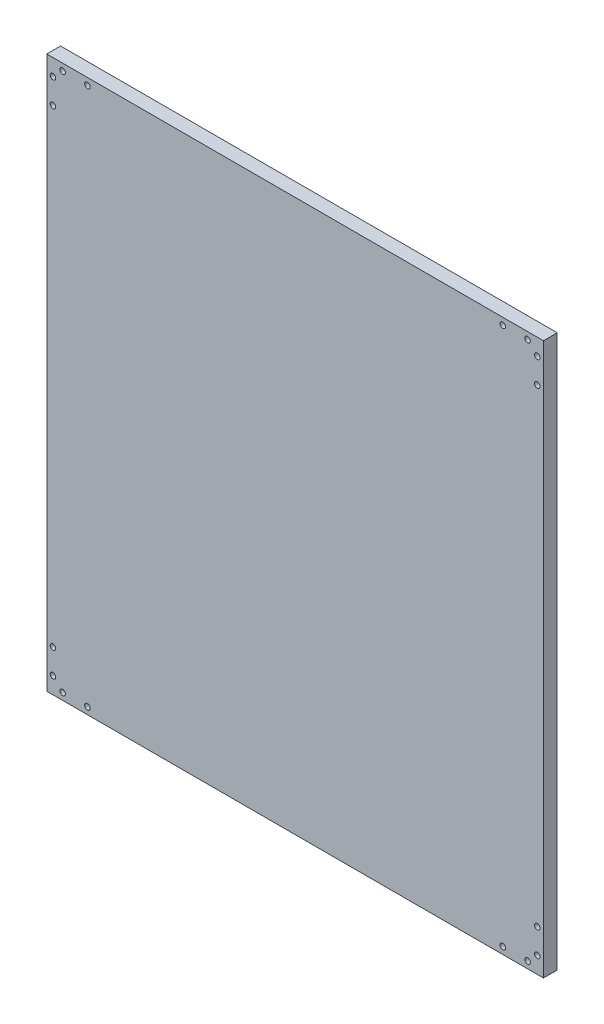
ISO-10303-21;
HEADER;
FILE_DESCRIPTION(('STEP AP214'),'2;1');
FILE_NAME('part.step','',(''),(''),'','','');
FILE_SCHEMA(('AUTOMOTIVE_DESIGN { 1 0 10303 214 1 1 1 1 }'));
ENDSEC;
DATA;
#1=APPLICATION_CONTEXT('core data for automotive mechanical design processes');
#2=APPLICATION_PROTOCOL_DEFINITION('international standard','automotive_design',2000,#1);
#3=PRODUCT_CONTEXT('',#1,'mechanical');
#4=PRODUCT('Part','Part','',(#3));
#5=PRODUCT_RELATED_PRODUCT_CATEGORY('part','',(#4));
#6=PRODUCT_DEFINITION_FORMATION('','',#4);
#7=PRODUCT_DEFINITION_CONTEXT('part definition',#1,'design');
#8=PRODUCT_DEFINITION('design','',#6,#7);
#9=PRODUCT_DEFINITION_SHAPE('','',#8);
#10=(LENGTH_UNIT() NAMED_UNIT(*) SI_UNIT(.MILLI.,.METRE.));
#11=(NAMED_UNIT(*) PLANE_ANGLE_UNIT() SI_UNIT($,.RADIAN.));
#12=(NAMED_UNIT(*) SI_UNIT($,.STERADIAN.) SOLID_ANGLE_UNIT());
#13=UNCERTAINTY_MEASURE_WITH_UNIT(LENGTH_MEASURE(1.E-05),#10,'distance_accuracy_value','');
#14=(GEOMETRIC_REPRESENTATION_CONTEXT(3) GLOBAL_UNCERTAINTY_ASSIGNED_CONTEXT((#13)) GLOBAL_UNIT_ASSIGNED_CONTEXT((#10,
#11,#12)) REPRESENTATION_CONTEXT('',''));
#15=CARTESIAN_POINT('',(0.,0.,0.));
#16=DIRECTION('',(0.,0.,1.));
#17=DIRECTION('',(1.,0.,0.));
#18=AXIS2_PLACEMENT_3D('',#15,#16,#17);
#19=CARTESIAN_POINT('',(0.,0.,10.));
#20=DIRECTION('',(0.,0.,-1.));
#21=DIRECTION('',(-1.,0.,0.));
#22=AXIS2_PLACEMENT_3D('',#19,#20,#21);
#23=PLANE('',#22);
#24=DIRECTION('',(0.,1.,0.));
#25=VECTOR('',#24,1.);
#26=CARTESIAN_POINT('',(180.,-200.,10.));
#27=LINE('',#26,#25);
#28=CARTESIAN_POINT('',(180.,-200.,10.));
#29=VERTEX_POINT('',#28);
#30=CARTESIAN_POINT('',(180.,200.,10.));
#31=VERTEX_POINT('',#30);
#32=EDGE_CURVE('E84',#29,#31,#27,.T.);
#33=ORIENTED_EDGE('',*,*,#32,.T.);
#34=DIRECTION('',(-1.,0.,0.));
#35=VECTOR('',#34,1.);
#36=CARTESIAN_POINT('',(-180.,200.,10.));
#37=LINE('',#36,#35);
#38=CARTESIAN_POINT('',(-180.,200.,10.));
#39=VERTEX_POINT('',#38);
#40=EDGE_CURVE('E79',#31,#39,#37,.T.);
#41=ORIENTED_EDGE('',*,*,#40,.T.);
#42=DIRECTION('',(0.,-1.,0.));
#43=VECTOR('',#42,1.);
#44=CARTESIAN_POINT('',(-180.,-200.,10.));
#45=LINE('',#44,#43);
#46=CARTESIAN_POINT('',(-180.,-200.,10.));
#47=VERTEX_POINT('',#46);
#48=EDGE_CURVE('E82',#39,#47,#45,.T.);
#49=ORIENTED_EDGE('',*,*,#48,.T.);
#50=DIRECTION('',(1.,0.,0.));
#51=VECTOR('',#50,1.);
#52=CARTESIAN_POINT('',(-180.,-200.,10.));
#53=LINE('',#52,#51);
#54=EDGE_CURVE('E49',#47,#29,#53,.T.);
#55=ORIENTED_EDGE('',*,*,#54,.T.);
#56=EDGE_LOOP('',(#33,#41,#49,#55));
#57=FACE_BOUND('',#56,.T.);
#58=CARTESIAN_POINT('',(150.5,195.,10.));
#59=DIRECTION('',(0.,0.,1.));
#60=DIRECTION('',(1.,0.,0.));
#61=AXIS2_PLACEMENT_3D('',#58,#59,#60);
#62=CIRCLE('',#61,2.);
#63=CARTESIAN_POINT('',(152.5,195.,10.));
#64=VERTEX_POINT('',#63);
#65=EDGE_CURVE('E99',#64,#64,#62,.T.);
#66=ORIENTED_EDGE('',*,*,#65,.F.);
#67=EDGE_LOOP('',(#66));
#68=FACE_BOUND('',#67,.T.);
#69=CARTESIAN_POINT('',(175.5,170.,10.));
#70=DIRECTION('',(0.,0.,1.));
#71=DIRECTION('',(1.,0.,0.));
#72=AXIS2_PLACEMENT_3D('',#69,#70,#71);
#73=CIRCLE('',#72,2.);
#74=CARTESIAN_POINT('',(177.5,170.,10.));
#75=VERTEX_POINT('',#74);
#76=EDGE_CURVE('E114',#75,#75,#73,.T.);
#77=ORIENTED_EDGE('',*,*,#76,.F.);
#78=EDGE_LOOP('',(#77));
#79=FACE_BOUND('',#78,.T.);
#80=CARTESIAN_POINT('',(168.5,195.,10.));
#81=DIRECTION('',(0.,0.,1.));
#82=DIRECTION('',(1.,0.,0.));
#83=AXIS2_PLACEMENT_3D('',#80,#81,#82);
#84=CIRCLE('',#83,2.);
#85=CARTESIAN_POINT('',(170.5,195.,10.));
#86=VERTEX_POINT('',#85);
#87=EDGE_CURVE('E120',#86,#86,#84,.T.);
#88=ORIENTED_EDGE('',*,*,#87,.F.);
#89=EDGE_LOOP('',(#88));
#90=FACE_BOUND('',#89,.T.);
#91=CARTESIAN_POINT('',(175.5,188.,10.));
#92=DIRECTION('',(0.,0.,1.));
#93=DIRECTION('',(1.,0.,0.));
#94=AXIS2_PLACEMENT_3D('',#91,#92,#93);
#95=CIRCLE('',#94,2.);
#96=CARTESIAN_POINT('',(177.5,188.,10.));
#97=VERTEX_POINT('',#96);
#98=EDGE_CURVE('E126',#97,#97,#95,.T.);
#99=ORIENTED_EDGE('',*,*,#98,.F.);
#100=EDGE_LOOP('',(#99));
#101=FACE_BOUND('',#100,.T.);
#102=CARTESIAN_POINT('',(-150.5,195.,9.99999999999881));
#103=DIRECTION('',(0.,0.,1.));
#104=DIRECTION('',(-1.,0.,0.));
#105=AXIS2_PLACEMENT_3D('',#102,#103,#104);
#106=CIRCLE('',#105,2.);
#107=CARTESIAN_POINT('',(-152.5,195.,9.9999999999988));
#108=VERTEX_POINT('',#107);
#109=EDGE_CURVE('E132',#108,#108,#106,.T.);
#110=ORIENTED_EDGE('',*,*,#109,.F.);
#111=EDGE_LOOP('',(#110));
#112=FACE_BOUND('',#111,.T.);
#113=CARTESIAN_POINT('',(-175.5,170.,9.99999999999864));
#114=DIRECTION('',(0.,0.,1.));
#115=DIRECTION('',(-1.,0.,0.));
#116=AXIS2_PLACEMENT_3D('',#113,#114,#115);
#117=CIRCLE('',#116,2.);
#118=CARTESIAN_POINT('',(-177.5,170.,9.99999999999863));
#119=VERTEX_POINT('',#118);
#120=EDGE_CURVE('E138',#119,#119,#117,.T.);
#121=ORIENTED_EDGE('',*,*,#120,.F.);
#122=EDGE_LOOP('',(#121));
#123=FACE_BOUND('',#122,.T.);
#124=CARTESIAN_POINT('',(-168.5,195.,9.99999999999869));
#125=DIRECTION('',(0.,0.,1.));
#126=DIRECTION('',(-1.,0.,0.));
#127=AXIS2_PLACEMENT_3D('',#124,#125,#126);
#128=CIRCLE('',#127,2.);
#129=CARTESIAN_POINT('',(-170.5,195.,9.99999999999867));
#130=VERTEX_POINT('',#129);
#131=EDGE_CURVE('E144',#130,#130,#128,.T.);
#132=ORIENTED_EDGE('',*,*,#131,.F.);
#133=EDGE_LOOP('',(#132));
#134=FACE_BOUND('',#133,.T.);
#135=CARTESIAN_POINT('',(-175.5,188.,9.99999999999864));
#136=DIRECTION('',(0.,0.,1.));
#137=DIRECTION('',(-1.,0.,0.));
#138=AXIS2_PLACEMENT_3D('',#135,#136,#137);
#139=CIRCLE('',#138,2.);
#140=CARTESIAN_POINT('',(-177.5,188.,9.99999999999863));
#141=VERTEX_POINT('',#140);
#142=EDGE_CURVE('E150',#141,#141,#139,.T.);
#143=ORIENTED_EDGE('',*,*,#142,.F.);
#144=EDGE_LOOP('',(#143));
#145=FACE_BOUND('',#144,.T.);
#146=CARTESIAN_POINT('',(-150.5,-195.,10.0000000000025));
#147=DIRECTION('',(0.,0.,1.));
#148=DIRECTION('',(0.,-1.,0.));
#149=AXIS2_PLACEMENT_3D('',#146,#147,#148);
#150=CIRCLE('',#149,2.);
#151=CARTESIAN_POINT('',(-150.5,-197.,10.0000000000026));
#152=VERTEX_POINT('',#151);
#153=EDGE_CURVE('E156',#152,#152,#150,.T.);
#154=ORIENTED_EDGE('',*,*,#153,.F.);
#155=EDGE_LOOP('',(#154));
#156=FACE_BOUND('',#155,.T.);
#157=CARTESIAN_POINT('',(-175.5,-170.,10.0000000000025));
#158=DIRECTION('',(0.,0.,1.));
#159=DIRECTION('',(0.,-1.,0.));
#160=AXIS2_PLACEMENT_3D('',#157,#158,#159);
#161=CIRCLE('',#160,2.);
#162=CARTESIAN_POINT('',(-175.5,-172.,10.0000000000026));
#163=VERTEX_POINT('',#162);
#164=EDGE_CURVE('E162',#163,#163,#161,.T.);
#165=ORIENTED_EDGE('',*,*,#164,.F.);
#166=EDGE_LOOP('',(#165));
#167=FACE_BOUND('',#166,.T.);
#168=CARTESIAN_POINT('',(-168.5,-195.,10.0000000000027));
#169=DIRECTION('',(0.,0.,1.));
#170=DIRECTION('',(0.,-1.,0.));
#171=AXIS2_PLACEMENT_3D('',#168,#169,#170);
#172=CIRCLE('',#171,2.);
#173=CARTESIAN_POINT('',(-168.5,-197.,10.0000000000027));
#174=VERTEX_POINT('',#173);
#175=EDGE_CURVE('E168',#174,#174,#172,.T.);
#176=ORIENTED_EDGE('',*,*,#175,.F.);
#177=EDGE_LOOP('',(#176));
#178=FACE_BOUND('',#177,.T.);
#179=CARTESIAN_POINT('',(-175.5,-188.,10.0000000000027));
#180=DIRECTION('',(0.,0.,1.));
#181=DIRECTION('',(0.,-1.,0.));
#182=AXIS2_PLACEMENT_3D('',#179,#180,#181);
#183=CIRCLE('',#182,2.);
#184=CARTESIAN_POINT('',(-175.5,-190.,10.0000000000027));
#185=VERTEX_POINT('',#184);
#186=EDGE_CURVE('E174',#185,#185,#183,.T.);
#187=ORIENTED_EDGE('',*,*,#186,.F.);
#188=EDGE_LOOP('',(#187));
#189=FACE_BOUND('',#188,.T.);
#190=CARTESIAN_POINT('',(150.5,-195.,10.0000000000014));
#191=DIRECTION('',(0.,0.,1.));
#192=DIRECTION('',(0.,1.,0.));
#193=AXIS2_PLACEMENT_3D('',#190,#191,#192);
#194=CIRCLE('',#193,2.);
#195=CARTESIAN_POINT('',(150.5,-193.,10.0000000000013));
#196=VERTEX_POINT('',#195);
#197=EDGE_CURVE('E180',#196,#196,#194,.T.);
#198=ORIENTED_EDGE('',*,*,#197,.F.);
#199=EDGE_LOOP('',(#198));
#200=FACE_BOUND('',#199,.T.);
#201=CARTESIAN_POINT('',(175.5,-170.,10.0000000000012));
#202=DIRECTION('',(0.,0.,1.));
#203=DIRECTION('',(0.,1.,0.));
#204=AXIS2_PLACEMENT_3D('',#201,#202,#203);
#205=CIRCLE('',#204,2.);
#206=CARTESIAN_POINT('',(175.5,-168.,10.0000000000012));
#207=VERTEX_POINT('',#206);
#208=EDGE_CURVE('E186',#207,#207,#205,.T.);
#209=ORIENTED_EDGE('',*,*,#208,.F.);
#210=EDGE_LOOP('',(#209));
#211=FACE_BOUND('',#210,.T.);
#212=CARTESIAN_POINT('',(168.5,-195.,10.0000000000014));
#213=DIRECTION('',(0.,0.,1.));
#214=DIRECTION('',(0.,1.,0.));
#215=AXIS2_PLACEMENT_3D('',#212,#213,#214);
#216=CIRCLE('',#215,2.);
#217=CARTESIAN_POINT('',(168.5,-193.,10.0000000000013));
#218=VERTEX_POINT('',#217);
#219=EDGE_CURVE('E192',#218,#218,#216,.T.);
#220=ORIENTED_EDGE('',*,*,#219,.F.);
#221=EDGE_LOOP('',(#220));
#222=FACE_BOUND('',#221,.T.);
#223=CARTESIAN_POINT('',(175.5,-188.,10.0000000000013));
#224=DIRECTION('',(0.,0.,1.));
#225=DIRECTION('',(0.,1.,0.));
#226=AXIS2_PLACEMENT_3D('',#223,#224,#225);
#227=CIRCLE('',#226,2.);
#228=CARTESIAN_POINT('',(175.5,-186.,10.0000000000013));
#229=VERTEX_POINT('',#228);
#230=EDGE_CURVE('E198',#229,#229,#227,.T.);
#231=ORIENTED_EDGE('',*,*,#230,.F.);
#232=EDGE_LOOP('',(#231));
#233=FACE_BOUND('',#232,.T.);
#234=ADVANCED_FACE('F32',(#57,#68,#79,#90,#101,#112,#123,#134,#145,#156,#167,#178,#189,#200,
#211,#222,#233),#23,.F.);
#235=CARTESIAN_POINT('',(0.,0.,0.));
#236=DIRECTION('',(0.,0.,-1.));
#237=DIRECTION('',(-1.,0.,0.));
#238=AXIS2_PLACEMENT_3D('',#235,#236,#237);
#239=PLANE('',#238);
#240=CARTESIAN_POINT('',(168.5,-195.,1.36167772214882E-12));
#241=DIRECTION('',(0.,0.,1.));
#242=DIRECTION('',(0.,1.,0.));
#243=AXIS2_PLACEMENT_3D('',#240,#241,#242);
#244=CIRCLE('',#243,2.);
#245=CARTESIAN_POINT('',(168.5,-193.,1.34771179679345E-12));
#246=VERTEX_POINT('',#245);
#247=EDGE_CURVE('E195',#246,#246,#244,.T.);
#248=ORIENTED_EDGE('',*,*,#247,.T.);
#249=EDGE_LOOP('',(#248));
#250=FACE_BOUND('',#249,.T.);
#251=CARTESIAN_POINT('',(150.5,-195.,1.36167772214882E-12));
#252=DIRECTION('',(0.,0.,1.));
#253=DIRECTION('',(0.,1.,0.));
#254=AXIS2_PLACEMENT_3D('',#251,#252,#253);
#255=CIRCLE('',#254,2.);
#256=CARTESIAN_POINT('',(150.5,-193.,1.34771179679345E-12));
#257=VERTEX_POINT('',#256);
#258=EDGE_CURVE('E183',#257,#257,#255,.T.);
#259=ORIENTED_EDGE('',*,*,#258,.T.);
#260=EDGE_LOOP('',(#259));
#261=FACE_BOUND('',#260,.T.);
#262=CARTESIAN_POINT('',(-168.5,-195.,2.67447470555384E-12));
#263=DIRECTION('',(0.,0.,1.));
#264=DIRECTION('',(0.,-1.,0.));
#265=AXIS2_PLACEMENT_3D('',#262,#263,#264);
#266=CIRCLE('',#265,2.);
#267=CARTESIAN_POINT('',(-168.5,-197.,2.68844063090921E-12));
#268=VERTEX_POINT('',#267);
#269=EDGE_CURVE('E171',#268,#268,#266,.T.);
#270=ORIENTED_EDGE('',*,*,#269,.T.);
#271=EDGE_LOOP('',(#270));
#272=FACE_BOUND('',#271,.T.);
#273=CARTESIAN_POINT('',(-150.5,-195.,2.54878137735549E-12));
#274=DIRECTION('',(0.,0.,1.));
#275=DIRECTION('',(0.,-1.,0.));
#276=AXIS2_PLACEMENT_3D('',#273,#274,#275);
#277=CIRCLE('',#276,2.);
#278=CARTESIAN_POINT('',(-150.5,-197.,2.56274730271086E-12));
#279=VERTEX_POINT('',#278);
#280=EDGE_CURVE('E159',#279,#279,#277,.T.);
#281=ORIENTED_EDGE('',*,*,#280,.T.);
#282=EDGE_LOOP('',(#281));
#283=FACE_BOUND('',#282,.T.);
#284=CARTESIAN_POINT('',(-168.5,195.,-1.31279698340502E-12));
#285=DIRECTION('',(0.,0.,1.));
#286=DIRECTION('',(-1.,0.,0.));
#287=AXIS2_PLACEMENT_3D('',#284,#285,#286);
#288=CIRCLE('',#287,2.);
#289=CARTESIAN_POINT('',(-170.5,195.,-1.32676290876039E-12));
#290=VERTEX_POINT('',#289);
#291=EDGE_CURVE('E147',#290,#290,#288,.T.);
#292=ORIENTED_EDGE('',*,*,#291,.T.);
#293=EDGE_LOOP('',(#292));
#294=FACE_BOUND('',#293,.T.);
#295=CARTESIAN_POINT('',(-150.5,195.,-1.18710365520667E-12));
#296=DIRECTION('',(0.,0.,1.));
#297=DIRECTION('',(-1.,0.,0.));
#298=AXIS2_PLACEMENT_3D('',#295,#296,#297);
#299=CIRCLE('',#298,2.);
#300=CARTESIAN_POINT('',(-152.5,195.,-1.20106958056204E-12));
#301=VERTEX_POINT('',#300);
#302=EDGE_CURVE('E135',#301,#301,#299,.T.);
#303=ORIENTED_EDGE('',*,*,#302,.T.);
#304=EDGE_LOOP('',(#303));
#305=FACE_BOUND('',#304,.T.);
#306=CARTESIAN_POINT('',(168.5,195.,0.));
#307=DIRECTION('',(0.,0.,1.));
#308=DIRECTION('',(1.,0.,0.));
#309=AXIS2_PLACEMENT_3D('',#306,#307,#308);
#310=CIRCLE('',#309,2.);
#311=CARTESIAN_POINT('',(170.5,195.,0.));
#312=VERTEX_POINT('',#311);
#313=EDGE_CURVE('E123',#312,#312,#310,.T.);
#314=ORIENTED_EDGE('',*,*,#313,.T.);
#315=EDGE_LOOP('',(#314));
#316=FACE_BOUND('',#315,.T.);
#317=CARTESIAN_POINT('',(150.5,195.,0.));
#318=DIRECTION('',(0.,0.,1.));
#319=DIRECTION('',(1.,0.,0.));
#320=AXIS2_PLACEMENT_3D('',#317,#318,#319);
#321=CIRCLE('',#320,2.);
#322=CARTESIAN_POINT('',(152.5,195.,0.));
#323=VERTEX_POINT('',#322);
#324=EDGE_CURVE('E111',#323,#323,#321,.T.);
#325=ORIENTED_EDGE('',*,*,#324,.T.);
#326=EDGE_LOOP('',(#325));
#327=FACE_BOUND('',#326,.T.);
#328=DIRECTION('',(0.,1.,0.));
#329=VECTOR('',#328,1.);
#330=CARTESIAN_POINT('',(180.,-200.,0.));
#331=LINE('',#330,#329);
#332=CARTESIAN_POINT('',(180.,-200.,0.));
#333=VERTEX_POINT('',#332);
#334=CARTESIAN_POINT('',(180.,200.,0.));
#335=VERTEX_POINT('',#334);
#336=EDGE_CURVE('E96',#333,#335,#331,.T.);
#337=ORIENTED_EDGE('',*,*,#336,.F.);
#338=DIRECTION('',(1.,0.,0.));
#339=VECTOR('',#338,1.);
#340=CARTESIAN_POINT('',(-180.,-200.,0.));
#341=LINE('',#340,#339);
#342=CARTESIAN_POINT('',(-180.,-200.,0.));
#343=VERTEX_POINT('',#342);
#344=EDGE_CURVE('E72',#343,#333,#341,.T.);
#345=ORIENTED_EDGE('',*,*,#344,.F.);
#346=DIRECTION('',(0.,-1.,0.));
#347=VECTOR('',#346,1.);
#348=CARTESIAN_POINT('',(-180.,-200.,0.));
#349=LINE('',#348,#347);
#350=CARTESIAN_POINT('',(-180.,200.,0.));
#351=VERTEX_POINT('',#350);
#352=EDGE_CURVE('E66',#351,#343,#349,.T.);
#353=ORIENTED_EDGE('',*,*,#352,.F.);
#354=DIRECTION('',(-1.,0.,0.));
#355=VECTOR('',#354,1.);
#356=CARTESIAN_POINT('',(-180.,200.,0.));
#357=LINE('',#356,#355);
#358=EDGE_CURVE('E88',#335,#351,#357,.T.);
#359=ORIENTED_EDGE('',*,*,#358,.F.);
#360=EDGE_LOOP('',(#337,#345,#353,#359));
#361=FACE_BOUND('',#360,.T.);
#362=CARTESIAN_POINT('',(175.5,170.,0.));
#363=DIRECTION('',(0.,0.,1.));
#364=DIRECTION('',(1.,0.,0.));
#365=AXIS2_PLACEMENT_3D('',#362,#363,#364);
#366=CIRCLE('',#365,2.);
#367=CARTESIAN_POINT('',(177.5,170.,0.));
#368=VERTEX_POINT('',#367);
#369=EDGE_CURVE('E117',#368,#368,#366,.T.);
#370=ORIENTED_EDGE('',*,*,#369,.T.);
#371=EDGE_LOOP('',(#370));
#372=FACE_BOUND('',#371,.T.);
#373=CARTESIAN_POINT('',(175.5,188.,0.));
#374=DIRECTION('',(0.,0.,1.));
#375=DIRECTION('',(1.,0.,0.));
#376=AXIS2_PLACEMENT_3D('',#373,#374,#375);
#377=CIRCLE('',#376,2.);
#378=CARTESIAN_POINT('',(177.5,188.,0.));
#379=VERTEX_POINT('',#378);
#380=EDGE_CURVE('E129',#379,#379,#377,.T.);
#381=ORIENTED_EDGE('',*,*,#380,.T.);
#382=EDGE_LOOP('',(#381));
#383=FACE_BOUND('',#382,.T.);
#384=CARTESIAN_POINT('',(-175.5,170.,-1.36167772214882E-12));
#385=DIRECTION('',(0.,0.,1.));
#386=DIRECTION('',(-1.,0.,0.));
#387=AXIS2_PLACEMENT_3D('',#384,#385,#386);
#388=CIRCLE('',#387,2.);
#389=CARTESIAN_POINT('',(-177.5,170.,-1.37564364750419E-12));
#390=VERTEX_POINT('',#389);
#391=EDGE_CURVE('E141',#390,#390,#388,.T.);
#392=ORIENTED_EDGE('',*,*,#391,.T.);
#393=EDGE_LOOP('',(#392));
#394=FACE_BOUND('',#393,.T.);
#395=CARTESIAN_POINT('',(-175.5,188.,-1.36167772214882E-12));
#396=DIRECTION('',(0.,0.,1.));
#397=DIRECTION('',(-1.,0.,0.));
#398=AXIS2_PLACEMENT_3D('',#395,#396,#397);
#399=CIRCLE('',#398,2.);
#400=CARTESIAN_POINT('',(-177.5,188.,-1.37564364750419E-12));
#401=VERTEX_POINT('',#400);
#402=EDGE_CURVE('E153',#401,#401,#399,.T.);
#403=ORIENTED_EDGE('',*,*,#402,.T.);
#404=EDGE_LOOP('',(#403));
#405=FACE_BOUND('',#404,.T.);
#406=CARTESIAN_POINT('',(-175.5,-170.,2.54878137735549E-12));
#407=DIRECTION('',(0.,0.,1.));
#408=DIRECTION('',(0.,-1.,0.));
#409=AXIS2_PLACEMENT_3D('',#406,#407,#408);
#410=CIRCLE('',#409,2.);
#411=CARTESIAN_POINT('',(-175.5,-172.,2.56274730271086E-12));
#412=VERTEX_POINT('',#411);
#413=EDGE_CURVE('E165',#412,#412,#410,.T.);
#414=ORIENTED_EDGE('',*,*,#413,.T.);
#415=EDGE_LOOP('',(#414));
#416=FACE_BOUND('',#415,.T.);
#417=CARTESIAN_POINT('',(-175.5,-188.,2.67447470555384E-12));
#418=DIRECTION('',(0.,0.,1.));
#419=DIRECTION('',(0.,-1.,0.));
#420=AXIS2_PLACEMENT_3D('',#417,#418,#419);
#421=CIRCLE('',#420,2.);
#422=CARTESIAN_POINT('',(-175.5,-190.,2.68844063090921E-12));
#423=VERTEX_POINT('',#422);
#424=EDGE_CURVE('E177',#423,#423,#421,.T.);
#425=ORIENTED_EDGE('',*,*,#424,.T.);
#426=EDGE_LOOP('',(#425));
#427=FACE_BOUND('',#426,.T.);
#428=CARTESIAN_POINT('',(175.5,-170.,1.18710365520667E-12));
#429=DIRECTION('',(0.,0.,1.));
#430=DIRECTION('',(0.,1.,0.));
#431=AXIS2_PLACEMENT_3D('',#428,#429,#430);
#432=CIRCLE('',#431,2.);
#433=CARTESIAN_POINT('',(175.5,-168.,1.17313772985129E-12));
#434=VERTEX_POINT('',#433);
#435=EDGE_CURVE('E189',#434,#434,#432,.T.);
#436=ORIENTED_EDGE('',*,*,#435,.T.);
#437=EDGE_LOOP('',(#436));
#438=FACE_BOUND('',#437,.T.);
#439=CARTESIAN_POINT('',(175.5,-188.,1.31279698340502E-12));
#440=DIRECTION('',(0.,0.,1.));
#441=DIRECTION('',(0.,1.,0.));
#442=AXIS2_PLACEMENT_3D('',#439,#440,#441);
#443=CIRCLE('',#442,2.);
#444=CARTESIAN_POINT('',(175.5,-186.,1.29883105804965E-12));
#445=VERTEX_POINT('',#444);
#446=EDGE_CURVE('E201',#445,#445,#443,.T.);
#447=ORIENTED_EDGE('',*,*,#446,.T.);
#448=EDGE_LOOP('',(#447));
#449=FACE_BOUND('',#448,.T.);
#450=ADVANCED_FACE('F107',(#250,#261,#272,#283,#294,#305,#316,#327,#361,#372,#383,#394,#405,
#416,#427,#438,#449),#239,.T.);
#451=CARTESIAN_POINT('',(180.,-200.,10.));
#452=DIRECTION('',(-1.,0.,0.));
#453=DIRECTION('',(0.,-1.,0.));
#454=AXIS2_PLACEMENT_3D('',#451,#452,#453);
#455=PLANE('',#454);
#456=ORIENTED_EDGE('',*,*,#336,.T.);
#457=DIRECTION('',(0.,0.,-1.));
#458=VECTOR('',#457,1.);
#459=CARTESIAN_POINT('',(180.,200.,10.));
#460=LINE('',#459,#458);
#461=EDGE_CURVE('E11',#31,#335,#460,.T.);
#462=ORIENTED_EDGE('',*,*,#461,.F.);
#463=ORIENTED_EDGE('',*,*,#32,.F.);
#464=DIRECTION('',(0.,0.,-1.));
#465=VECTOR('',#464,1.);
#466=CARTESIAN_POINT('',(180.,-200.,10.));
#467=LINE('',#466,#465);
#468=EDGE_CURVE('E92',#29,#333,#467,.T.);
#469=ORIENTED_EDGE('',*,*,#468,.T.);
#470=EDGE_LOOP('',(#456,#462,#463,#469));
#471=FACE_BOUND('',#470,.T.);
#472=ADVANCED_FACE('F34',(#471),#455,.F.);
#473=CARTESIAN_POINT('',(-180.,200.,10.));
#474=DIRECTION('',(0.,-1.,0.));
#475=DIRECTION('',(1.,0.,0.));
#476=AXIS2_PLACEMENT_3D('',#473,#474,#475);
#477=PLANE('',#476);
#478=ORIENTED_EDGE('',*,*,#358,.T.);
#479=DIRECTION('',(0.,0.,-1.));
#480=VECTOR('',#479,1.);
#481=CARTESIAN_POINT('',(-180.,200.,10.));
#482=LINE('',#481,#480);
#483=EDGE_CURVE('E41',#39,#351,#482,.T.);
#484=ORIENTED_EDGE('',*,*,#483,.F.);
#485=ORIENTED_EDGE('',*,*,#40,.F.);
#486=ORIENTED_EDGE('',*,*,#461,.T.);
#487=EDGE_LOOP('',(#478,#484,#485,#486));
#488=FACE_BOUND('',#487,.T.);
#489=ADVANCED_FACE('F87',(#488),#477,.F.);
#490=CARTESIAN_POINT('',(-180.,-200.,10.));
#491=DIRECTION('',(1.,0.,0.));
#492=DIRECTION('',(0.,0.,-1.));
#493=AXIS2_PLACEMENT_3D('',#490,#491,#492);
#494=PLANE('',#493);
#495=ORIENTED_EDGE('',*,*,#352,.T.);
#496=DIRECTION('',(0.,0.,-1.));
#497=VECTOR('',#496,1.);
#498=CARTESIAN_POINT('',(-180.,-200.,10.));
#499=LINE('',#498,#497);
#500=EDGE_CURVE('E89',#47,#343,#499,.T.);
#501=ORIENTED_EDGE('',*,*,#500,.F.);
#502=ORIENTED_EDGE('',*,*,#48,.F.);
#503=ORIENTED_EDGE('',*,*,#483,.T.);
#504=EDGE_LOOP('',(#495,#501,#502,#503));
#505=FACE_BOUND('',#504,.T.);
#506=ADVANCED_FACE('F90',(#505),#494,.F.);
#507=CARTESIAN_POINT('',(-180.,-200.,10.));
#508=DIRECTION('',(0.,1.,0.));
#509=DIRECTION('',(-1.,0.,0.));
#510=AXIS2_PLACEMENT_3D('',#507,#508,#509);
#511=PLANE('',#510);
#512=ORIENTED_EDGE('',*,*,#344,.T.);
#513=ORIENTED_EDGE('',*,*,#468,.F.);
#514=ORIENTED_EDGE('',*,*,#54,.F.);
#515=ORIENTED_EDGE('',*,*,#500,.T.);
#516=EDGE_LOOP('',(#512,#513,#514,#515));
#517=FACE_BOUND('',#516,.T.);
#518=ADVANCED_FACE('F104',(#517),#511,.F.);
#519=CARTESIAN_POINT('',(150.5,195.,10.));
#520=DIRECTION('',(0.,0.,-1.));
#521=DIRECTION('',(-1.,0.,0.));
#522=AXIS2_PLACEMENT_3D('',#519,#520,#521);
#523=CYLINDRICAL_SURFACE('',#522,2.);
#524=ORIENTED_EDGE('',*,*,#65,.T.);
#525=EDGE_LOOP('',(#524));
#526=FACE_BOUND('',#525,.T.);
#527=ORIENTED_EDGE('',*,*,#324,.F.);
#528=EDGE_LOOP('',(#527));
#529=FACE_BOUND('',#528,.T.);
#530=ADVANCED_FACE('F218',(#526,#529),#523,.F.);
#531=CARTESIAN_POINT('',(175.5,170.,10.));
#532=DIRECTION('',(0.,0.,-1.));
#533=DIRECTION('',(-1.,0.,0.));
#534=AXIS2_PLACEMENT_3D('',#531,#532,#533);
#535=CYLINDRICAL_SURFACE('',#534,2.);
#536=ORIENTED_EDGE('',*,*,#76,.T.);
#537=EDGE_LOOP('',(#536));
#538=FACE_BOUND('',#537,.T.);
#539=ORIENTED_EDGE('',*,*,#369,.F.);
#540=EDGE_LOOP('',(#539));
#541=FACE_BOUND('',#540,.T.);
#542=ADVANCED_FACE('F264',(#538,#541),#535,.F.);
#543=CARTESIAN_POINT('',(168.5,195.,10.));
#544=DIRECTION('',(0.,0.,-1.));
#545=DIRECTION('',(-1.,0.,0.));
#546=AXIS2_PLACEMENT_3D('',#543,#544,#545);
#547=CYLINDRICAL_SURFACE('',#546,2.);
#548=ORIENTED_EDGE('',*,*,#87,.T.);
#549=EDGE_LOOP('',(#548));
#550=FACE_BOUND('',#549,.T.);
#551=ORIENTED_EDGE('',*,*,#313,.F.);
#552=EDGE_LOOP('',(#551));
#553=FACE_BOUND('',#552,.T.);
#554=ADVANCED_FACE('F272',(#550,#553),#547,.F.);
#555=CARTESIAN_POINT('',(175.5,188.,10.));
#556=DIRECTION('',(0.,0.,-1.));
#557=DIRECTION('',(-1.,0.,0.));
#558=AXIS2_PLACEMENT_3D('',#555,#556,#557);
#559=CYLINDRICAL_SURFACE('',#558,2.);
#560=ORIENTED_EDGE('',*,*,#98,.T.);
#561=EDGE_LOOP('',(#560));
#562=FACE_BOUND('',#561,.T.);
#563=ORIENTED_EDGE('',*,*,#380,.F.);
#564=EDGE_LOOP('',(#563));
#565=FACE_BOUND('',#564,.T.);
#566=ADVANCED_FACE('F280',(#562,#565),#559,.F.);
#567=CARTESIAN_POINT('',(-150.5,195.,9.99999999999881));
#568=DIRECTION('',(0.,0.,-1.));
#569=DIRECTION('',(-1.,0.,0.));
#570=AXIS2_PLACEMENT_3D('',#567,#568,#569);
#571=CYLINDRICAL_SURFACE('',#570,2.);
#572=ORIENTED_EDGE('',*,*,#109,.T.);
#573=EDGE_LOOP('',(#572));
#574=FACE_BOUND('',#573,.T.);
#575=ORIENTED_EDGE('',*,*,#302,.F.);
#576=EDGE_LOOP('',(#575));
#577=FACE_BOUND('',#576,.T.);
#578=ADVANCED_FACE('F289',(#574,#577),#571,.F.);
#579=CARTESIAN_POINT('',(-175.5,170.,9.99999999999864));
#580=DIRECTION('',(0.,0.,-1.));
#581=DIRECTION('',(-1.,0.,0.));
#582=AXIS2_PLACEMENT_3D('',#579,#580,#581);
#583=CYLINDRICAL_SURFACE('',#582,2.);
#584=ORIENTED_EDGE('',*,*,#120,.T.);
#585=EDGE_LOOP('',(#584));
#586=FACE_BOUND('',#585,.T.);
#587=ORIENTED_EDGE('',*,*,#391,.F.);
#588=EDGE_LOOP('',(#587));
#589=FACE_BOUND('',#588,.T.);
#590=ADVANCED_FACE('F298',(#586,#589),#583,.F.);
#591=CARTESIAN_POINT('',(-168.5,195.,9.99999999999869));
#592=DIRECTION('',(0.,0.,-1.));
#593=DIRECTION('',(-1.,0.,0.));
#594=AXIS2_PLACEMENT_3D('',#591,#592,#593);
#595=CYLINDRICAL_SURFACE('',#594,2.);
#596=ORIENTED_EDGE('',*,*,#131,.T.);
#597=EDGE_LOOP('',(#596));
#598=FACE_BOUND('',#597,.T.);
#599=ORIENTED_EDGE('',*,*,#291,.F.);
#600=EDGE_LOOP('',(#599));
#601=FACE_BOUND('',#600,.T.);
#602=ADVANCED_FACE('F307',(#598,#601),#595,.F.);
#603=CARTESIAN_POINT('',(-175.5,188.,9.99999999999864));
#604=DIRECTION('',(0.,0.,-1.));
#605=DIRECTION('',(-1.,0.,0.));
#606=AXIS2_PLACEMENT_3D('',#603,#604,#605);
#607=CYLINDRICAL_SURFACE('',#606,2.);
#608=ORIENTED_EDGE('',*,*,#142,.T.);
#609=EDGE_LOOP('',(#608));
#610=FACE_BOUND('',#609,.T.);
#611=ORIENTED_EDGE('',*,*,#402,.F.);
#612=EDGE_LOOP('',(#611));
#613=FACE_BOUND('',#612,.T.);
#614=ADVANCED_FACE('F316',(#610,#613),#607,.F.);
#615=CARTESIAN_POINT('',(-150.5,-195.,10.0000000000025));
#616=DIRECTION('',(0.,0.,-1.));
#617=DIRECTION('',(-1.,0.,0.));
#618=AXIS2_PLACEMENT_3D('',#615,#616,#617);
#619=CYLINDRICAL_SURFACE('',#618,2.);
#620=ORIENTED_EDGE('',*,*,#153,.T.);
#621=EDGE_LOOP('',(#620));
#622=FACE_BOUND('',#621,.T.);
#623=ORIENTED_EDGE('',*,*,#280,.F.);
#624=EDGE_LOOP('',(#623));
#625=FACE_BOUND('',#624,.T.);
#626=ADVANCED_FACE('F325',(#622,#625),#619,.F.);
#627=CARTESIAN_POINT('',(-175.5,-170.,10.0000000000025));
#628=DIRECTION('',(0.,0.,-1.));
#629=DIRECTION('',(-1.,0.,0.));
#630=AXIS2_PLACEMENT_3D('',#627,#628,#629);
#631=CYLINDRICAL_SURFACE('',#630,2.);
#632=ORIENTED_EDGE('',*,*,#164,.T.);
#633=EDGE_LOOP('',(#632));
#634=FACE_BOUND('',#633,.T.);
#635=ORIENTED_EDGE('',*,*,#413,.F.);
#636=EDGE_LOOP('',(#635));
#637=FACE_BOUND('',#636,.T.);
#638=ADVANCED_FACE('F334',(#634,#637),#631,.F.);
#639=CARTESIAN_POINT('',(-168.5,-195.,10.0000000000027));
#640=DIRECTION('',(0.,0.,-1.));
#641=DIRECTION('',(-1.,0.,0.));
#642=AXIS2_PLACEMENT_3D('',#639,#640,#641);
#643=CYLINDRICAL_SURFACE('',#642,2.);
#644=ORIENTED_EDGE('',*,*,#175,.T.);
#645=EDGE_LOOP('',(#644));
#646=FACE_BOUND('',#645,.T.);
#647=ORIENTED_EDGE('',*,*,#269,.F.);
#648=EDGE_LOOP('',(#647));
#649=FACE_BOUND('',#648,.T.);
#650=ADVANCED_FACE('F343',(#646,#649),#643,.F.);
#651=CARTESIAN_POINT('',(-175.5,-188.,10.0000000000027));
#652=DIRECTION('',(0.,0.,-1.));
#653=DIRECTION('',(-1.,0.,0.));
#654=AXIS2_PLACEMENT_3D('',#651,#652,#653);
#655=CYLINDRICAL_SURFACE('',#654,2.);
#656=ORIENTED_EDGE('',*,*,#186,.T.);
#657=EDGE_LOOP('',(#656));
#658=FACE_BOUND('',#657,.T.);
#659=ORIENTED_EDGE('',*,*,#424,.F.);
#660=EDGE_LOOP('',(#659));
#661=FACE_BOUND('',#660,.T.);
#662=ADVANCED_FACE('F352',(#658,#661),#655,.F.);
#663=CARTESIAN_POINT('',(150.5,-195.,10.0000000000014));
#664=DIRECTION('',(0.,0.,-1.));
#665=DIRECTION('',(-1.,0.,0.));
#666=AXIS2_PLACEMENT_3D('',#663,#664,#665);
#667=CYLINDRICAL_SURFACE('',#666,2.);
#668=ORIENTED_EDGE('',*,*,#197,.T.);
#669=EDGE_LOOP('',(#668));
#670=FACE_BOUND('',#669,.T.);
#671=ORIENTED_EDGE('',*,*,#258,.F.);
#672=EDGE_LOOP('',(#671));
#673=FACE_BOUND('',#672,.T.);
#674=ADVANCED_FACE('F361',(#670,#673),#667,.F.);
#675=CARTESIAN_POINT('',(175.5,-170.,10.0000000000012));
#676=DIRECTION('',(0.,0.,-1.));
#677=DIRECTION('',(-1.,0.,0.));
#678=AXIS2_PLACEMENT_3D('',#675,#676,#677);
#679=CYLINDRICAL_SURFACE('',#678,2.);
#680=ORIENTED_EDGE('',*,*,#208,.T.);
#681=EDGE_LOOP('',(#680));
#682=FACE_BOUND('',#681,.T.);
#683=ORIENTED_EDGE('',*,*,#435,.F.);
#684=EDGE_LOOP('',(#683));
#685=FACE_BOUND('',#684,.T.);
#686=ADVANCED_FACE('F370',(#682,#685),#679,.F.);
#687=CARTESIAN_POINT('',(168.5,-195.,10.0000000000014));
#688=DIRECTION('',(0.,0.,-1.));
#689=DIRECTION('',(-1.,0.,0.));
#690=AXIS2_PLACEMENT_3D('',#687,#688,#689);
#691=CYLINDRICAL_SURFACE('',#690,2.);
#692=ORIENTED_EDGE('',*,*,#219,.T.);
#693=EDGE_LOOP('',(#692));
#694=FACE_BOUND('',#693,.T.);
#695=ORIENTED_EDGE('',*,*,#247,.F.);
#696=EDGE_LOOP('',(#695));
#697=FACE_BOUND('',#696,.T.);
#698=ADVANCED_FACE('F379',(#694,#697),#691,.F.);
#699=CARTESIAN_POINT('',(175.5,-188.,10.0000000000013));
#700=DIRECTION('',(0.,0.,-1.));
#701=DIRECTION('',(-1.,0.,0.));
#702=AXIS2_PLACEMENT_3D('',#699,#700,#701);
#703=CYLINDRICAL_SURFACE('',#702,2.);
#704=ORIENTED_EDGE('',*,*,#230,.T.);
#705=EDGE_LOOP('',(#704));
#706=FACE_BOUND('',#705,.T.);
#707=ORIENTED_EDGE('',*,*,#446,.F.);
#708=EDGE_LOOP('',(#707));
#709=FACE_BOUND('',#708,.T.);
#710=ADVANCED_FACE('F207',(#706,#709),#703,.F.);
#711=CLOSED_SHELL('',(#234,#450,#472,#489,#506,#518,#530,#542,#554,#566,#578,#590,#602,#614,
#626,#638,#650,#662,#674,#686,#698,#710));
#712=MANIFOLD_SOLID_BREP('B2',#711);
#713=ADVANCED_BREP_SHAPE_REPRESENTATION('',(#18,#712),#14);
#714=SHAPE_DEFINITION_REPRESENTATION(#9,#713);
ENDSEC;
END-ISO-10303-21;
